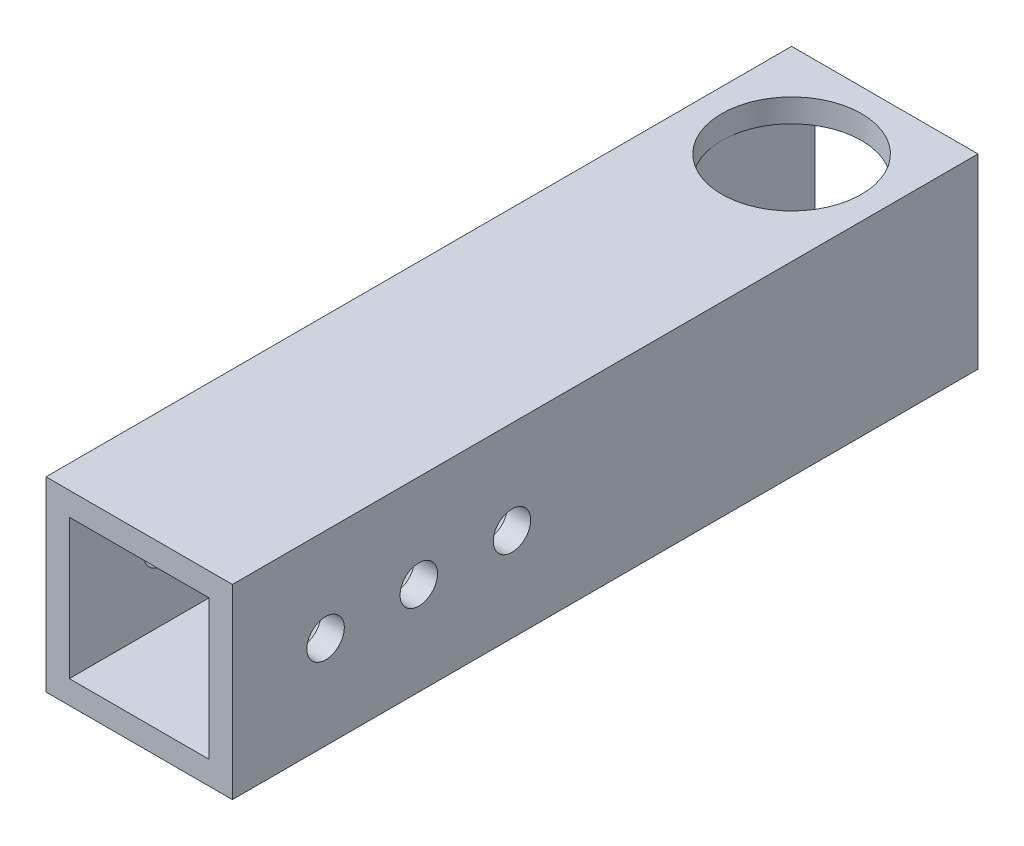
ISO-10303-21;
HEADER;
FILE_DESCRIPTION(('STEP AP214'),'2;1');
FILE_NAME('part.step','',(''),(''),'','','');
FILE_SCHEMA(('AUTOMOTIVE_DESIGN { 1 0 10303 214 1 1 1 1 }'));
ENDSEC;
DATA;
#1=APPLICATION_CONTEXT('core data for automotive mechanical design processes');
#2=APPLICATION_PROTOCOL_DEFINITION('international standard','automotive_design',2000,#1);
#3=PRODUCT_CONTEXT('',#1,'mechanical');
#4=PRODUCT('Part','Part','',(#3));
#5=PRODUCT_RELATED_PRODUCT_CATEGORY('part','',(#4));
#6=PRODUCT_DEFINITION_FORMATION('','',#4);
#7=PRODUCT_DEFINITION_CONTEXT('part definition',#1,'design');
#8=PRODUCT_DEFINITION('design','',#6,#7);
#9=PRODUCT_DEFINITION_SHAPE('','',#8);
#10=(LENGTH_UNIT() NAMED_UNIT(*) SI_UNIT(.MILLI.,.METRE.));
#11=(NAMED_UNIT(*) PLANE_ANGLE_UNIT() SI_UNIT($,.RADIAN.));
#12=(NAMED_UNIT(*) SI_UNIT($,.STERADIAN.) SOLID_ANGLE_UNIT());
#13=UNCERTAINTY_MEASURE_WITH_UNIT(LENGTH_MEASURE(1.E-05),#10,'distance_accuracy_value','');
#14=(GEOMETRIC_REPRESENTATION_CONTEXT(3) GLOBAL_UNCERTAINTY_ASSIGNED_CONTEXT((#13)) GLOBAL_UNIT_ASSIGNED_CONTEXT((#10,
#11,#12)) REPRESENTATION_CONTEXT('',''));
#15=CARTESIAN_POINT('',(0.,0.,0.));
#16=DIRECTION('',(0.,0.,1.));
#17=DIRECTION('',(1.,0.,0.));
#18=AXIS2_PLACEMENT_3D('',#15,#16,#17);
#19=CARTESIAN_POINT('',(-25.4,0.,101.6));
#20=DIRECTION('',(1.,0.,0.));
#21=DIRECTION('',(0.,0.,-1.));
#22=AXIS2_PLACEMENT_3D('',#19,#20,#21);
#23=PLANE('',#22);
#24=CARTESIAN_POINT('',(-25.4,12.7,88.9));
#25=DIRECTION('',(1.,0.,0.));
#26=DIRECTION('',(0.,0.,-1.));
#27=AXIS2_PLACEMENT_3D('',#24,#25,#26);
#28=CIRCLE('',#27,2.55269999999999);
#29=CARTESIAN_POINT('',(-25.4,12.7,86.3473));
#30=VERTEX_POINT('',#29);
#31=EDGE_CURVE('E234',#30,#30,#28,.F.);
#32=ORIENTED_EDGE('',*,*,#31,.F.);
#33=EDGE_LOOP('',(#32));
#34=FACE_BOUND('',#33,.T.);
#35=CARTESIAN_POINT('',(-25.4,12.7,63.5));
#36=DIRECTION('',(1.,0.,0.));
#37=DIRECTION('',(0.,0.,-1.));
#38=AXIS2_PLACEMENT_3D('',#35,#36,#37);
#39=CIRCLE('',#38,2.55269999999999);
#40=CARTESIAN_POINT('',(-25.4,12.7,60.9473));
#41=VERTEX_POINT('',#40);
#42=EDGE_CURVE('E229',#41,#41,#39,.F.);
#43=ORIENTED_EDGE('',*,*,#42,.F.);
#44=EDGE_LOOP('',(#43));
#45=FACE_BOUND('',#44,.T.);
#46=DIRECTION('',(0.,-1.,0.));
#47=VECTOR('',#46,1.);
#48=CARTESIAN_POINT('',(-25.4,0.,0.));
#49=LINE('',#48,#47);
#50=CARTESIAN_POINT('',(-25.4,25.4,0.));
#51=VERTEX_POINT('',#50);
#52=CARTESIAN_POINT('',(-25.4,0.,0.));
#53=VERTEX_POINT('',#52);
#54=EDGE_CURVE('E206',#51,#53,#49,.T.);
#55=ORIENTED_EDGE('',*,*,#54,.T.);
#56=DIRECTION('',(0.,0.,-1.));
#57=VECTOR('',#56,1.);
#58=CARTESIAN_POINT('',(-25.4,0.,101.6));
#59=LINE('',#58,#57);
#60=CARTESIAN_POINT('',(-25.4,0.,101.6));
#61=VERTEX_POINT('',#60);
#62=EDGE_CURVE('E214',#61,#53,#59,.T.);
#63=ORIENTED_EDGE('',*,*,#62,.F.);
#64=DIRECTION('',(0.,-1.,0.));
#65=VECTOR('',#64,1.);
#66=CARTESIAN_POINT('',(-25.4,0.,101.6));
#67=LINE('',#66,#65);
#68=CARTESIAN_POINT('',(-25.4,25.4,101.6));
#69=VERTEX_POINT('',#68);
#70=EDGE_CURVE('E193',#69,#61,#67,.T.);
#71=ORIENTED_EDGE('',*,*,#70,.F.);
#72=DIRECTION('',(0.,0.,-1.));
#73=VECTOR('',#72,1.);
#74=CARTESIAN_POINT('',(-25.4,25.4,101.6));
#75=LINE('',#74,#73);
#76=EDGE_CURVE('E218',#69,#51,#75,.T.);
#77=ORIENTED_EDGE('',*,*,#76,.T.);
#78=EDGE_LOOP('',(#55,#63,#71,#77));
#79=FACE_BOUND('',#78,.T.);
#80=CARTESIAN_POINT('',(-25.4,12.7,76.2));
#81=DIRECTION('',(1.,0.,0.));
#82=DIRECTION('',(0.,0.,-1.));
#83=AXIS2_PLACEMENT_3D('',#80,#81,#82);
#84=CIRCLE('',#83,2.55269999999999);
#85=CARTESIAN_POINT('',(-25.4,12.7,73.6473));
#86=VERTEX_POINT('',#85);
#87=EDGE_CURVE('E374',#86,#86,#84,.F.);
#88=ORIENTED_EDGE('',*,*,#87,.F.);
#89=EDGE_LOOP('',(#88));
#90=FACE_BOUND('',#89,.T.);
#91=ADVANCED_FACE('F62',(#34,#45,#79,#90),#23,.F.);
#92=CARTESIAN_POINT('',(0.,22.225,101.6));
#93=DIRECTION('',(0.,-1.,0.));
#94=DIRECTION('',(1.,0.,0.));
#95=AXIS2_PLACEMENT_3D('',#92,#93,#94);
#96=PLANE('',#95);
#97=CARTESIAN_POINT('',(-12.7,22.225,12.7));
#98=DIRECTION('',(0.,-1.,0.));
#99=DIRECTION('',(1.,0.,0.));
#100=AXIS2_PLACEMENT_3D('',#97,#98,#99);
#101=CIRCLE('',#100,9.525);
#102=CARTESIAN_POINT('',(-3.175,22.225,12.7));
#103=VERTEX_POINT('',#102);
#104=CARTESIAN_POINT('',(-22.225,22.225,12.7));
#105=VERTEX_POINT('',#104);
#106=EDGE_CURVE('E79',#103,#105,#101,.T.);
#107=ORIENTED_EDGE('',*,*,#106,.F.);
#108=DIRECTION('',(0.,0.,-1.));
#109=VECTOR('',#108,1.);
#110=CARTESIAN_POINT('',(-3.175,22.225,101.6));
#111=LINE('',#110,#109);
#112=CARTESIAN_POINT('',(-3.175,22.225,101.6));
#113=VERTEX_POINT('',#112);
#114=EDGE_CURVE('E180',#113,#103,#111,.T.);
#115=ORIENTED_EDGE('',*,*,#114,.F.);
#116=DIRECTION('',(-1.,0.,0.));
#117=VECTOR('',#116,1.);
#118=CARTESIAN_POINT('',(0.,22.225,101.6));
#119=LINE('',#118,#117);
#120=CARTESIAN_POINT('',(-22.225,22.225,101.6));
#121=VERTEX_POINT('',#120);
#122=EDGE_CURVE('E277',#113,#121,#119,.T.);
#123=ORIENTED_EDGE('',*,*,#122,.T.);
#124=DIRECTION('',(0.,0.,-1.));
#125=VECTOR('',#124,1.);
#126=CARTESIAN_POINT('',(-22.225,22.225,101.6));
#127=LINE('',#126,#125);
#128=EDGE_CURVE('E175',#121,#105,#127,.T.);
#129=ORIENTED_EDGE('',*,*,#128,.T.);
#130=EDGE_LOOP('',(#107,#115,#123,#129));
#131=FACE_BOUND('',#130,.T.);
#132=ADVANCED_FACE('F313',(#131),#96,.T.);
#133=CARTESIAN_POINT('',(0.,3.175,101.6));
#134=DIRECTION('',(0.,1.,0.));
#135=DIRECTION('',(0.,0.,1.));
#136=AXIS2_PLACEMENT_3D('',#133,#134,#135);
#137=PLANE('',#136);
#138=CARTESIAN_POINT('',(-12.7,3.175,12.7));
#139=DIRECTION('',(0.,1.,0.));
#140=DIRECTION('',(0.,0.,1.));
#141=AXIS2_PLACEMENT_3D('',#138,#139,#140);
#142=CIRCLE('',#141,9.525);
#143=CARTESIAN_POINT('',(-3.175,3.175,12.7));
#144=VERTEX_POINT('',#143);
#145=CARTESIAN_POINT('',(-22.225,3.175,12.7));
#146=VERTEX_POINT('',#145);
#147=EDGE_CURVE('E12',#144,#146,#142,.T.);
#148=ORIENTED_EDGE('',*,*,#147,.F.);
#149=DIRECTION('',(0.,0.,-1.));
#150=VECTOR('',#149,1.);
#151=CARTESIAN_POINT('',(-3.175,3.175,101.6));
#152=LINE('',#151,#150);
#153=CARTESIAN_POINT('',(-3.175,3.175,0.));
#154=VERTEX_POINT('',#153);
#155=EDGE_CURVE('E148',#144,#154,#152,.T.);
#156=ORIENTED_EDGE('',*,*,#155,.T.);
#157=DIRECTION('',(1.,0.,0.));
#158=VECTOR('',#157,1.);
#159=CARTESIAN_POINT('',(0.,3.175,0.));
#160=LINE('',#159,#158);
#161=CARTESIAN_POINT('',(-22.225,3.175,0.));
#162=VERTEX_POINT('',#161);
#163=EDGE_CURVE('E170',#162,#154,#160,.T.);
#164=ORIENTED_EDGE('',*,*,#163,.F.);
#165=DIRECTION('',(0.,0.,-1.));
#166=VECTOR('',#165,1.);
#167=CARTESIAN_POINT('',(-22.225,3.175,101.6));
#168=LINE('',#167,#166);
#169=EDGE_CURVE('E150',#146,#162,#168,.T.);
#170=ORIENTED_EDGE('',*,*,#169,.F.);
#171=EDGE_LOOP('',(#148,#156,#164,#170));
#172=FACE_BOUND('',#171,.T.);
#173=ADVANCED_FACE('F146',(#172),#137,.T.);
#174=CARTESIAN_POINT('',(0.,0.,101.6));
#175=DIRECTION('',(0.,0.,1.));
#176=DIRECTION('',(1.,0.,0.));
#177=AXIS2_PLACEMENT_3D('',#174,#175,#176);
#178=PLANE('',#177);
#179=DIRECTION('',(0.,1.,0.));
#180=VECTOR('',#179,1.);
#181=CARTESIAN_POINT('',(0.,0.,101.6));
#182=LINE('',#181,#180);
#183=CARTESIAN_POINT('',(0.,0.,101.6));
#184=VERTEX_POINT('',#183);
#185=CARTESIAN_POINT('',(0.,25.4,101.6));
#186=VERTEX_POINT('',#185);
#187=EDGE_CURVE('E185',#184,#186,#182,.T.);
#188=ORIENTED_EDGE('',*,*,#187,.T.);
#189=DIRECTION('',(-1.,0.,0.));
#190=VECTOR('',#189,1.);
#191=CARTESIAN_POINT('',(0.,25.4,101.6));
#192=LINE('',#191,#190);
#193=EDGE_CURVE('E189',#186,#69,#192,.T.);
#194=ORIENTED_EDGE('',*,*,#193,.T.);
#195=ORIENTED_EDGE('',*,*,#70,.T.);
#196=DIRECTION('',(1.,0.,0.));
#197=VECTOR('',#196,1.);
#198=CARTESIAN_POINT('',(0.,0.,101.6));
#199=LINE('',#198,#197);
#200=EDGE_CURVE('E196',#61,#184,#199,.T.);
#201=ORIENTED_EDGE('',*,*,#200,.T.);
#202=EDGE_LOOP('',(#188,#194,#195,#201));
#203=FACE_BOUND('',#202,.T.);
#204=ORIENTED_EDGE('',*,*,#122,.F.);
#205=DIRECTION('',(0.,1.,0.));
#206=VECTOR('',#205,1.);
#207=CARTESIAN_POINT('',(-3.175,0.,101.6));
#208=LINE('',#207,#206);
#209=CARTESIAN_POINT('',(-3.175,3.175,101.6));
#210=VERTEX_POINT('',#209);
#211=EDGE_CURVE('E274',#210,#113,#208,.T.);
#212=ORIENTED_EDGE('',*,*,#211,.F.);
#213=DIRECTION('',(1.,0.,0.));
#214=VECTOR('',#213,1.);
#215=CARTESIAN_POINT('',(0.,3.175,101.6));
#216=LINE('',#215,#214);
#217=CARTESIAN_POINT('',(-22.225,3.175,101.6));
#218=VERTEX_POINT('',#217);
#219=EDGE_CURVE('E161',#218,#210,#216,.T.);
#220=ORIENTED_EDGE('',*,*,#219,.F.);
#221=DIRECTION('',(0.,-1.,0.));
#222=VECTOR('',#221,1.);
#223=CARTESIAN_POINT('',(-22.225,0.,101.6));
#224=LINE('',#223,#222);
#225=EDGE_CURVE('E280',#121,#218,#224,.T.);
#226=ORIENTED_EDGE('',*,*,#225,.F.);
#227=EDGE_LOOP('',(#204,#212,#220,#226));
#228=FACE_BOUND('',#227,.T.);
#229=ADVANCED_FACE('F310',(#203,#228),#178,.T.);
#230=CARTESIAN_POINT('',(0.,0.,0.));
#231=DIRECTION('',(0.,0.,1.));
#232=DIRECTION('',(1.,0.,0.));
#233=AXIS2_PLACEMENT_3D('',#230,#231,#232);
#234=PLANE('',#233);
#235=DIRECTION('',(0.,1.,0.));
#236=VECTOR('',#235,1.);
#237=CARTESIAN_POINT('',(0.,0.,0.));
#238=LINE('',#237,#236);
#239=CARTESIAN_POINT('',(0.,0.,0.));
#240=VERTEX_POINT('',#239);
#241=CARTESIAN_POINT('',(0.,25.4,0.));
#242=VERTEX_POINT('',#241);
#243=EDGE_CURVE('E184',#240,#242,#238,.T.);
#244=ORIENTED_EDGE('',*,*,#243,.F.);
#245=DIRECTION('',(1.,0.,0.));
#246=VECTOR('',#245,1.);
#247=CARTESIAN_POINT('',(0.,0.,0.));
#248=LINE('',#247,#246);
#249=EDGE_CURVE('E190',#53,#240,#248,.T.);
#250=ORIENTED_EDGE('',*,*,#249,.F.);
#251=ORIENTED_EDGE('',*,*,#54,.F.);
#252=DIRECTION('',(-1.,0.,0.));
#253=VECTOR('',#252,1.);
#254=CARTESIAN_POINT('',(0.,25.4,0.));
#255=LINE('',#254,#253);
#256=EDGE_CURVE('E203',#242,#51,#255,.T.);
#257=ORIENTED_EDGE('',*,*,#256,.F.);
#258=EDGE_LOOP('',(#244,#250,#251,#257));
#259=FACE_BOUND('',#258,.T.);
#260=DIRECTION('',(0.,1.,0.));
#261=VECTOR('',#260,1.);
#262=CARTESIAN_POINT('',(-3.175,0.,0.));
#263=LINE('',#262,#261);
#264=CARTESIAN_POINT('',(-3.175,22.225,0.));
#265=VERTEX_POINT('',#264);
#266=EDGE_CURVE('E158',#154,#265,#263,.T.);
#267=ORIENTED_EDGE('',*,*,#266,.T.);
#268=DIRECTION('',(-1.,0.,0.));
#269=VECTOR('',#268,1.);
#270=CARTESIAN_POINT('',(0.,22.225,0.));
#271=LINE('',#270,#269);
#272=CARTESIAN_POINT('',(-22.225,22.225,0.));
#273=VERTEX_POINT('',#272);
#274=EDGE_CURVE('E288',#265,#273,#271,.T.);
#275=ORIENTED_EDGE('',*,*,#274,.T.);
#276=DIRECTION('',(0.,-1.,0.));
#277=VECTOR('',#276,1.);
#278=CARTESIAN_POINT('',(-22.225,0.,0.));
#279=LINE('',#278,#277);
#280=EDGE_CURVE('E291',#273,#162,#279,.T.);
#281=ORIENTED_EDGE('',*,*,#280,.T.);
#282=ORIENTED_EDGE('',*,*,#163,.T.);
#283=EDGE_LOOP('',(#267,#275,#281,#282));
#284=FACE_BOUND('',#283,.T.);
#285=ADVANCED_FACE('F297',(#259,#284),#234,.F.);
#286=CARTESIAN_POINT('',(0.,0.,101.6));
#287=DIRECTION('',(-1.,0.,0.));
#288=DIRECTION('',(0.,-1.,0.));
#289=AXIS2_PLACEMENT_3D('',#286,#287,#288);
#290=PLANE('',#289);
#291=CARTESIAN_POINT('',(0.,12.7,76.2));
#292=DIRECTION('',(1.,0.,0.));
#293=DIRECTION('',(0.,0.,-1.));
#294=AXIS2_PLACEMENT_3D('',#291,#292,#293);
#295=CIRCLE('',#294,2.55269999999999);
#296=CARTESIAN_POINT('',(0.,12.7,73.6473));
#297=VERTEX_POINT('',#296);
#298=EDGE_CURVE('E377',#297,#297,#295,.T.);
#299=ORIENTED_EDGE('',*,*,#298,.F.);
#300=EDGE_LOOP('',(#299));
#301=FACE_BOUND('',#300,.T.);
#302=CARTESIAN_POINT('',(0.,12.7,88.9));
#303=DIRECTION('',(1.,0.,0.));
#304=DIRECTION('',(0.,0.,-1.));
#305=AXIS2_PLACEMENT_3D('',#302,#303,#304);
#306=CIRCLE('',#305,2.55269999999999);
#307=CARTESIAN_POINT('',(0.,12.7,86.3473));
#308=VERTEX_POINT('',#307);
#309=EDGE_CURVE('E243',#308,#308,#306,.T.);
#310=ORIENTED_EDGE('',*,*,#309,.F.);
#311=EDGE_LOOP('',(#310));
#312=FACE_BOUND('',#311,.T.);
#313=CARTESIAN_POINT('',(0.,12.7,63.5));
#314=DIRECTION('',(1.,0.,0.));
#315=DIRECTION('',(0.,0.,-1.));
#316=AXIS2_PLACEMENT_3D('',#313,#314,#315);
#317=CIRCLE('',#316,2.55269999999999);
#318=CARTESIAN_POINT('',(0.,12.7,60.9473));
#319=VERTEX_POINT('',#318);
#320=EDGE_CURVE('E240',#319,#319,#317,.T.);
#321=ORIENTED_EDGE('',*,*,#320,.F.);
#322=EDGE_LOOP('',(#321));
#323=FACE_BOUND('',#322,.T.);
#324=ORIENTED_EDGE('',*,*,#243,.T.);
#325=DIRECTION('',(0.,0.,-1.));
#326=VECTOR('',#325,1.);
#327=CARTESIAN_POINT('',(0.,25.4,101.6));
#328=LINE('',#327,#326);
#329=EDGE_CURVE('E143',#186,#242,#328,.T.);
#330=ORIENTED_EDGE('',*,*,#329,.F.);
#331=ORIENTED_EDGE('',*,*,#187,.F.);
#332=DIRECTION('',(0.,0.,-1.));
#333=VECTOR('',#332,1.);
#334=CARTESIAN_POINT('',(0.,0.,101.6));
#335=LINE('',#334,#333);
#336=EDGE_CURVE('E199',#184,#240,#335,.T.);
#337=ORIENTED_EDGE('',*,*,#336,.T.);
#338=EDGE_LOOP('',(#324,#330,#331,#337));
#339=FACE_BOUND('',#338,.T.);
#340=ADVANCED_FACE('F64',(#301,#312,#323,#339),#290,.F.);
#341=CARTESIAN_POINT('',(0.,25.4,101.6));
#342=DIRECTION('',(0.,-1.,0.));
#343=DIRECTION('',(1.,0.,0.));
#344=AXIS2_PLACEMENT_3D('',#341,#342,#343);
#345=PLANE('',#344);
#346=CARTESIAN_POINT('',(-12.7,25.4,12.7));
#347=DIRECTION('',(0.,-1.,0.));
#348=DIRECTION('',(0.,0.,-1.));
#349=AXIS2_PLACEMENT_3D('',#346,#347,#348);
#350=CIRCLE('',#349,9.525);
#351=CARTESIAN_POINT('',(-12.7,25.4,3.175));
#352=VERTEX_POINT('',#351);
#353=EDGE_CURVE('E264',#352,#352,#350,.T.);
#354=ORIENTED_EDGE('',*,*,#353,.T.);
#355=EDGE_LOOP('',(#354));
#356=FACE_BOUND('',#355,.T.);
#357=ORIENTED_EDGE('',*,*,#256,.T.);
#358=ORIENTED_EDGE('',*,*,#76,.F.);
#359=ORIENTED_EDGE('',*,*,#193,.F.);
#360=ORIENTED_EDGE('',*,*,#329,.T.);
#361=EDGE_LOOP('',(#357,#358,#359,#360));
#362=FACE_BOUND('',#361,.T.);
#363=ADVANCED_FACE('F340',(#356,#362),#345,.F.);
#364=CARTESIAN_POINT('',(0.,0.,101.6));
#365=DIRECTION('',(0.,1.,0.));
#366=DIRECTION('',(0.,0.,1.));
#367=AXIS2_PLACEMENT_3D('',#364,#365,#366);
#368=PLANE('',#367);
#369=CARTESIAN_POINT('',(-12.7,0.,12.7));
#370=DIRECTION('',(0.,-1.,0.));
#371=DIRECTION('',(0.,0.,-1.));
#372=AXIS2_PLACEMENT_3D('',#369,#370,#371);
#373=CIRCLE('',#372,9.525);
#374=CARTESIAN_POINT('',(-12.7,0.,3.175));
#375=VERTEX_POINT('',#374);
#376=EDGE_CURVE('E263',#375,#375,#373,.T.);
#377=ORIENTED_EDGE('',*,*,#376,.F.);
#378=EDGE_LOOP('',(#377));
#379=FACE_BOUND('',#378,.T.);
#380=ORIENTED_EDGE('',*,*,#249,.T.);
#381=ORIENTED_EDGE('',*,*,#336,.F.);
#382=ORIENTED_EDGE('',*,*,#200,.F.);
#383=ORIENTED_EDGE('',*,*,#62,.T.);
#384=EDGE_LOOP('',(#380,#381,#382,#383));
#385=FACE_BOUND('',#384,.T.);
#386=ADVANCED_FACE('F335',(#379,#385),#368,.F.);
#387=CARTESIAN_POINT('',(-3.175,0.,101.6));
#388=DIRECTION('',(-1.,0.,0.));
#389=DIRECTION('',(0.,-1.,0.));
#390=AXIS2_PLACEMENT_3D('',#387,#388,#389);
#391=PLANE('',#390);
#392=CARTESIAN_POINT('',(-3.175,12.7,76.2));
#393=DIRECTION('',(-1.,0.,0.));
#394=DIRECTION('',(0.,-1.,0.));
#395=AXIS2_PLACEMENT_3D('',#392,#393,#394);
#396=CIRCLE('',#395,2.55269999999999);
#397=CARTESIAN_POINT('',(-3.175,10.1473,76.2));
#398=VERTEX_POINT('',#397);
#399=EDGE_CURVE('E249',#398,#398,#396,.T.);
#400=ORIENTED_EDGE('',*,*,#399,.F.);
#401=EDGE_LOOP('',(#400));
#402=FACE_BOUND('',#401,.T.);
#403=CARTESIAN_POINT('',(-3.175,12.7,88.9));
#404=DIRECTION('',(-1.,0.,0.));
#405=DIRECTION('',(0.,-1.,0.));
#406=AXIS2_PLACEMENT_3D('',#403,#404,#405);
#407=CIRCLE('',#406,2.55269999999999);
#408=CARTESIAN_POINT('',(-3.175,10.1473,88.9));
#409=VERTEX_POINT('',#408);
#410=EDGE_CURVE('E233',#409,#409,#407,.T.);
#411=ORIENTED_EDGE('',*,*,#410,.F.);
#412=EDGE_LOOP('',(#411));
#413=FACE_BOUND('',#412,.T.);
#414=CARTESIAN_POINT('',(-3.175,12.7,63.5));
#415=DIRECTION('',(-1.,0.,0.));
#416=DIRECTION('',(0.,-1.,0.));
#417=AXIS2_PLACEMENT_3D('',#414,#415,#416);
#418=CIRCLE('',#417,2.55269999999999);
#419=CARTESIAN_POINT('',(-3.175,10.1473,63.5));
#420=VERTEX_POINT('',#419);
#421=EDGE_CURVE('E225',#420,#420,#418,.T.);
#422=ORIENTED_EDGE('',*,*,#421,.F.);
#423=EDGE_LOOP('',(#422));
#424=FACE_BOUND('',#423,.T.);
#425=ORIENTED_EDGE('',*,*,#155,.F.);
#426=EDGE_CURVE('E155',#210,#144,#152,.T.);
#427=ORIENTED_EDGE('',*,*,#426,.F.);
#428=ORIENTED_EDGE('',*,*,#211,.T.);
#429=ORIENTED_EDGE('',*,*,#114,.T.);
#430=EDGE_CURVE('E179',#103,#265,#111,.T.);
#431=ORIENTED_EDGE('',*,*,#430,.T.);
#432=ORIENTED_EDGE('',*,*,#266,.F.);
#433=EDGE_LOOP('',(#425,#427,#428,#429,#431,#432));
#434=FACE_BOUND('',#433,.T.);
#435=ADVANCED_FACE('F154',(#402,#413,#424,#434),#391,.T.);
#436=EDGE_CURVE('E268',#105,#103,#101,.T.);
#437=ORIENTED_EDGE('',*,*,#436,.F.);
#438=EDGE_CURVE('E174',#105,#273,#127,.T.);
#439=ORIENTED_EDGE('',*,*,#438,.T.);
#440=ORIENTED_EDGE('',*,*,#274,.F.);
#441=ORIENTED_EDGE('',*,*,#430,.F.);
#442=EDGE_LOOP('',(#437,#439,#440,#441));
#443=FACE_BOUND('',#442,.T.);
#444=ADVANCED_FACE('F301',(#443),#96,.T.);
#445=CARTESIAN_POINT('',(-22.225,0.,101.6));
#446=DIRECTION('',(1.,0.,0.));
#447=DIRECTION('',(0.,0.,-1.));
#448=AXIS2_PLACEMENT_3D('',#445,#446,#447);
#449=PLANE('',#448);
#450=CARTESIAN_POINT('',(-22.225,12.7,76.2));
#451=DIRECTION('',(1.,0.,0.));
#452=DIRECTION('',(0.,0.,-1.));
#453=AXIS2_PLACEMENT_3D('',#450,#451,#452);
#454=CIRCLE('',#453,2.55269999999999);
#455=CARTESIAN_POINT('',(-22.225,12.7,73.6473));
#456=VERTEX_POINT('',#455);
#457=EDGE_CURVE('E66',#456,#456,#454,.T.);
#458=ORIENTED_EDGE('',*,*,#457,.F.);
#459=EDGE_LOOP('',(#458));
#460=FACE_BOUND('',#459,.T.);
#461=CARTESIAN_POINT('',(-22.225,12.7,88.9));
#462=DIRECTION('',(1.,0.,0.));
#463=DIRECTION('',(0.,0.,-1.));
#464=AXIS2_PLACEMENT_3D('',#461,#462,#463);
#465=CIRCLE('',#464,2.55269999999999);
#466=CARTESIAN_POINT('',(-22.225,12.7,86.3473));
#467=VERTEX_POINT('',#466);
#468=EDGE_CURVE('E230',#467,#467,#465,.T.);
#469=ORIENTED_EDGE('',*,*,#468,.F.);
#470=EDGE_LOOP('',(#469));
#471=FACE_BOUND('',#470,.T.);
#472=CARTESIAN_POINT('',(-22.225,12.7,63.5));
#473=DIRECTION('',(1.,0.,0.));
#474=DIRECTION('',(0.,0.,-1.));
#475=AXIS2_PLACEMENT_3D('',#472,#473,#474);
#476=CIRCLE('',#475,2.55269999999999);
#477=CARTESIAN_POINT('',(-22.225,12.7,60.9473));
#478=VERTEX_POINT('',#477);
#479=EDGE_CURVE('E228',#478,#478,#476,.T.);
#480=ORIENTED_EDGE('',*,*,#479,.F.);
#481=EDGE_LOOP('',(#480));
#482=FACE_BOUND('',#481,.T.);
#483=EDGE_CURVE('E167',#218,#146,#168,.T.);
#484=ORIENTED_EDGE('',*,*,#483,.T.);
#485=ORIENTED_EDGE('',*,*,#169,.T.);
#486=ORIENTED_EDGE('',*,*,#280,.F.);
#487=ORIENTED_EDGE('',*,*,#438,.F.);
#488=ORIENTED_EDGE('',*,*,#128,.F.);
#489=ORIENTED_EDGE('',*,*,#225,.T.);
#490=EDGE_LOOP('',(#484,#485,#486,#487,#488,#489));
#491=FACE_BOUND('',#490,.T.);
#492=ADVANCED_FACE('F306',(#460,#471,#482,#491),#449,.T.);
#493=EDGE_CURVE('E72',#146,#144,#142,.T.);
#494=ORIENTED_EDGE('',*,*,#493,.F.);
#495=ORIENTED_EDGE('',*,*,#483,.F.);
#496=ORIENTED_EDGE('',*,*,#219,.T.);
#497=ORIENTED_EDGE('',*,*,#426,.T.);
#498=EDGE_LOOP('',(#494,#495,#496,#497));
#499=FACE_BOUND('',#498,.T.);
#500=ADVANCED_FACE('F163',(#499),#137,.T.);
#501=CARTESIAN_POINT('',(-12.7,25.4,12.7));
#502=DIRECTION('',(0.,-1.,0.));
#503=DIRECTION('',(0.,0.,-1.));
#504=AXIS2_PLACEMENT_3D('',#501,#502,#503);
#505=CYLINDRICAL_SURFACE('',#504,9.525);
#506=ORIENTED_EDGE('',*,*,#147,.T.);
#507=ORIENTED_EDGE('',*,*,#493,.T.);
#508=EDGE_LOOP('',(#506,#507));
#509=FACE_BOUND('',#508,.T.);
#510=ORIENTED_EDGE('',*,*,#376,.T.);
#511=EDGE_LOOP('',(#510));
#512=FACE_BOUND('',#511,.T.);
#513=ADVANCED_FACE('F137',(#509,#512),#505,.F.);
#514=ORIENTED_EDGE('',*,*,#106,.T.);
#515=ORIENTED_EDGE('',*,*,#436,.T.);
#516=EDGE_LOOP('',(#514,#515));
#517=FACE_BOUND('',#516,.T.);
#518=ORIENTED_EDGE('',*,*,#353,.F.);
#519=EDGE_LOOP('',(#518));
#520=FACE_BOUND('',#519,.T.);
#521=ADVANCED_FACE('F394',(#517,#520),#505,.F.);
#522=CARTESIAN_POINT('',(0.,12.7,63.5));
#523=DIRECTION('',(1.,0.,0.));
#524=DIRECTION('',(0.,0.,-1.));
#525=AXIS2_PLACEMENT_3D('',#522,#523,#524);
#526=CYLINDRICAL_SURFACE('',#525,2.55269999999999);
#527=ORIENTED_EDGE('',*,*,#421,.T.);
#528=EDGE_LOOP('',(#527));
#529=FACE_BOUND('',#528,.T.);
#530=ORIENTED_EDGE('',*,*,#320,.T.);
#531=EDGE_LOOP('',(#530));
#532=FACE_BOUND('',#531,.T.);
#533=ADVANCED_FACE('F391',(#529,#532),#526,.F.);
#534=ORIENTED_EDGE('',*,*,#479,.T.);
#535=EDGE_LOOP('',(#534));
#536=FACE_BOUND('',#535,.T.);
#537=ORIENTED_EDGE('',*,*,#42,.T.);
#538=EDGE_LOOP('',(#537));
#539=FACE_BOUND('',#538,.T.);
#540=ADVANCED_FACE('F393',(#536,#539),#526,.F.);
#541=CARTESIAN_POINT('',(0.,12.7,88.9));
#542=DIRECTION('',(1.,0.,0.));
#543=DIRECTION('',(0.,0.,-1.));
#544=AXIS2_PLACEMENT_3D('',#541,#542,#543);
#545=CYLINDRICAL_SURFACE('',#544,2.55269999999999);
#546=ORIENTED_EDGE('',*,*,#468,.T.);
#547=EDGE_LOOP('',(#546));
#548=FACE_BOUND('',#547,.T.);
#549=ORIENTED_EDGE('',*,*,#31,.T.);
#550=EDGE_LOOP('',(#549));
#551=FACE_BOUND('',#550,.T.);
#552=ADVANCED_FACE('F401',(#548,#551),#545,.F.);
#553=ORIENTED_EDGE('',*,*,#410,.T.);
#554=EDGE_LOOP('',(#553));
#555=FACE_BOUND('',#554,.T.);
#556=ORIENTED_EDGE('',*,*,#309,.T.);
#557=EDGE_LOOP('',(#556));
#558=FACE_BOUND('',#557,.T.);
#559=ADVANCED_FACE('F477',(#555,#558),#545,.F.);
#560=CARTESIAN_POINT('',(0.,12.7,76.2));
#561=DIRECTION('',(1.,0.,0.));
#562=DIRECTION('',(0.,0.,-1.));
#563=AXIS2_PLACEMENT_3D('',#560,#561,#562);
#564=CYLINDRICAL_SURFACE('',#563,2.55269999999999);
#565=ORIENTED_EDGE('',*,*,#457,.T.);
#566=EDGE_LOOP('',(#565));
#567=FACE_BOUND('',#566,.T.);
#568=ORIENTED_EDGE('',*,*,#87,.T.);
#569=EDGE_LOOP('',(#568));
#570=FACE_BOUND('',#569,.T.);
#571=ADVANCED_FACE('F485',(#567,#570),#564,.F.);
#572=ORIENTED_EDGE('',*,*,#399,.T.);
#573=EDGE_LOOP('',(#572));
#574=FACE_BOUND('',#573,.T.);
#575=ORIENTED_EDGE('',*,*,#298,.T.);
#576=EDGE_LOOP('',(#575));
#577=FACE_BOUND('',#576,.T.);
#578=ADVANCED_FACE('F385',(#574,#577),#564,.F.);
#579=CLOSED_SHELL('',(#91,#132,#173,#229,#285,#340,#363,#386,#435,#444,#492,#500,#513,#521,#533,
#540,#552,#559,#571,#578));
#580=MANIFOLD_SOLID_BREP('B2',#579);
#581=ADVANCED_BREP_SHAPE_REPRESENTATION('',(#18,#580),#14);
#582=SHAPE_DEFINITION_REPRESENTATION(#9,#581);
ENDSEC;
END-ISO-10303-21;
